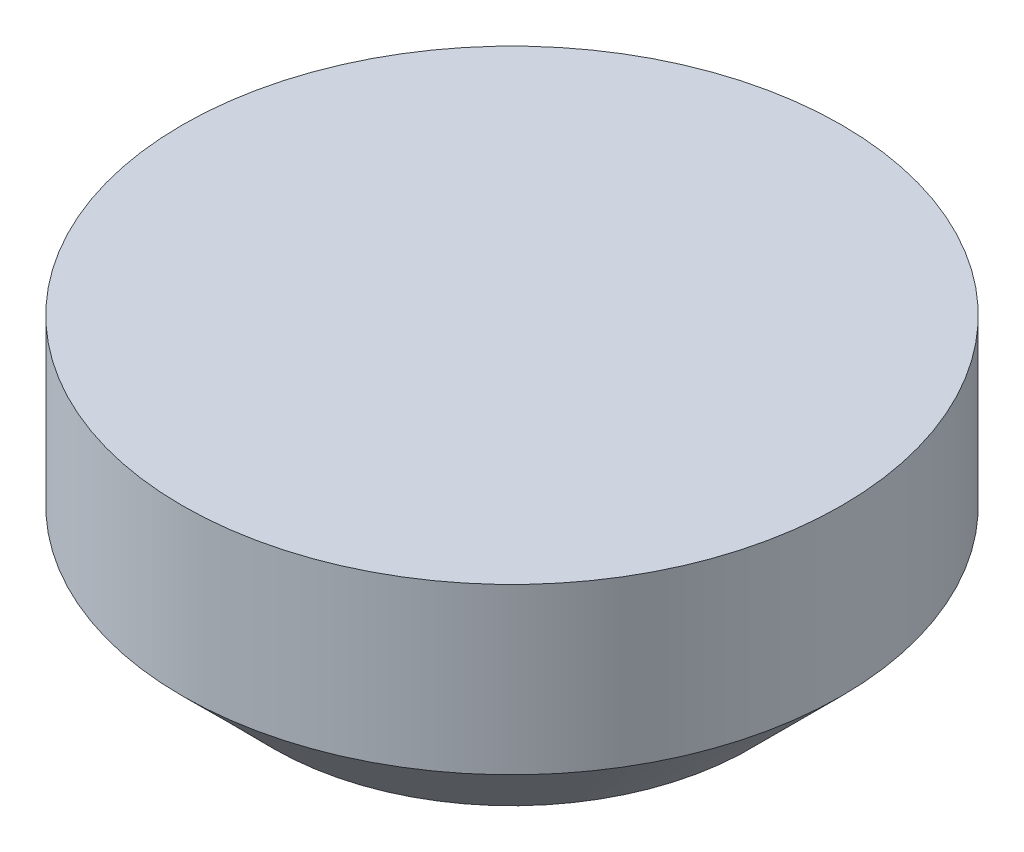
ISO-10303-21;
HEADER;
FILE_DESCRIPTION(('STEP AP214'),'2;1');
FILE_NAME('part.step','',(''),(''),'','','');
FILE_SCHEMA(('AUTOMOTIVE_DESIGN { 1 0 10303 214 1 1 1 1 }'));
ENDSEC;
DATA;
#1=APPLICATION_CONTEXT('core data for automotive mechanical design processes');
#2=APPLICATION_PROTOCOL_DEFINITION('international standard','automotive_design',2000,#1);
#3=PRODUCT_CONTEXT('',#1,'mechanical');
#4=PRODUCT('Part','Part','',(#3));
#5=PRODUCT_RELATED_PRODUCT_CATEGORY('part','',(#4));
#6=PRODUCT_DEFINITION_FORMATION('','',#4);
#7=PRODUCT_DEFINITION_CONTEXT('part definition',#1,'design');
#8=PRODUCT_DEFINITION('design','',#6,#7);
#9=PRODUCT_DEFINITION_SHAPE('','',#8);
#10=(LENGTH_UNIT() NAMED_UNIT(*) SI_UNIT(.MILLI.,.METRE.));
#11=(NAMED_UNIT(*) PLANE_ANGLE_UNIT() SI_UNIT($,.RADIAN.));
#12=(NAMED_UNIT(*) SI_UNIT($,.STERADIAN.) SOLID_ANGLE_UNIT());
#13=UNCERTAINTY_MEASURE_WITH_UNIT(LENGTH_MEASURE(1.E-05),#10,'distance_accuracy_value','');
#14=(GEOMETRIC_REPRESENTATION_CONTEXT(3) GLOBAL_UNCERTAINTY_ASSIGNED_CONTEXT((#13)) GLOBAL_UNIT_ASSIGNED_CONTEXT((#10,
#11,#12)) REPRESENTATION_CONTEXT('',''));
#15=CARTESIAN_POINT('',(0.,0.,0.));
#16=DIRECTION('',(0.,0.,1.));
#17=DIRECTION('',(1.,0.,0.));
#18=AXIS2_PLACEMENT_3D('',#15,#16,#17);
#19=CARTESIAN_POINT('',(0.,0.,0.));
#20=DIRECTION('',(0.,-1.,0.));
#21=DIRECTION('',(0.,0.,-1.));
#22=AXIS2_PLACEMENT_3D('',#19,#20,#21);
#23=PLANE('',#22);
#24=CARTESIAN_POINT('',(0.,0.,0.));
#25=DIRECTION('',(0.,-1.,0.));
#26=DIRECTION('',(0.,0.,-1.));
#27=AXIS2_PLACEMENT_3D('',#24,#25,#26);
#28=CIRCLE('',#27,9.);
#29=CARTESIAN_POINT('',(0.,0.,-9.));
#30=VERTEX_POINT('',#29);
#31=EDGE_CURVE('E10',#30,#30,#28,.T.);
#32=ORIENTED_EDGE('',*,*,#31,.F.);
#33=EDGE_LOOP('',(#32));
#34=FACE_BOUND('',#33,.T.);
#35=ADVANCED_FACE('F33',(#34),#23,.F.);
#36=CARTESIAN_POINT('',(0.,-2.,0.));
#37=DIRECTION('',(0.,-1.,0.));
#38=DIRECTION('',(0.,0.,-1.));
#39=AXIS2_PLACEMENT_3D('',#36,#37,#38);
#40=CYLINDRICAL_SURFACE('',#39,9.);
#41=CARTESIAN_POINT('',(0.,-4.5,0.));
#42=DIRECTION('',(0.,-1.,0.));
#43=DIRECTION('',(0.,0.,-1.));
#44=AXIS2_PLACEMENT_3D('',#41,#42,#43);
#45=CIRCLE('',#44,9.);
#46=CARTESIAN_POINT('',(0.,-4.5,-9.));
#47=VERTEX_POINT('',#46);
#48=EDGE_CURVE('E39',#47,#47,#45,.T.);
#49=ORIENTED_EDGE('',*,*,#48,.F.);
#50=EDGE_LOOP('',(#49));
#51=FACE_BOUND('',#50,.T.);
#52=ORIENTED_EDGE('',*,*,#31,.T.);
#53=EDGE_LOOP('',(#52));
#54=FACE_BOUND('',#53,.T.);
#55=ADVANCED_FACE('F72',(#51,#54),#40,.T.);
#56=CARTESIAN_POINT('',(0.,-4.5,0.));
#57=DIRECTION('',(0.,1.,0.));
#58=DIRECTION('',(0.,0.,1.));
#59=AXIS2_PLACEMENT_3D('',#56,#57,#58);
#60=CONICAL_SURFACE('',#59,9.,0.785398163397448);
#61=CARTESIAN_POINT('',(0.,-7.,0.));
#62=DIRECTION('',(0.,-1.,0.));
#63=DIRECTION('',(0.,0.,-1.));
#64=AXIS2_PLACEMENT_3D('',#61,#62,#63);
#65=CIRCLE('',#64,6.5);
#66=CARTESIAN_POINT('',(0.,-7.,-6.5));
#67=VERTEX_POINT('',#66);
#68=EDGE_CURVE('E43',#67,#67,#65,.T.);
#69=ORIENTED_EDGE('',*,*,#68,.F.);
#70=EDGE_LOOP('',(#69));
#71=FACE_BOUND('',#70,.T.);
#72=ORIENTED_EDGE('',*,*,#48,.T.);
#73=EDGE_LOOP('',(#72));
#74=FACE_BOUND('',#73,.T.);
#75=ADVANCED_FACE('F67',(#71,#74),#60,.T.);
#76=CARTESIAN_POINT('',(-6.5,-7.,0.));
#77=DIRECTION('',(0.,1.,0.));
#78=DIRECTION('',(0.,0.,1.));
#79=AXIS2_PLACEMENT_3D('',#76,#77,#78);
#80=PLANE('',#79);
#81=CARTESIAN_POINT('',(0.,-7.,0.));
#82=DIRECTION('',(0.,-1.,0.));
#83=DIRECTION('',(0.,0.,-1.));
#84=AXIS2_PLACEMENT_3D('',#81,#82,#83);
#85=CIRCLE('',#84,6.);
#86=CARTESIAN_POINT('',(0.,-7.,-6.));
#87=VERTEX_POINT('',#86);
#88=EDGE_CURVE('E47',#87,#87,#85,.T.);
#89=ORIENTED_EDGE('',*,*,#88,.F.);
#90=EDGE_LOOP('',(#89));
#91=FACE_BOUND('',#90,.T.);
#92=ORIENTED_EDGE('',*,*,#68,.T.);
#93=EDGE_LOOP('',(#92));
#94=FACE_BOUND('',#93,.T.);
#95=ADVANCED_FACE('F61',(#91,#94),#80,.F.);
#96=CARTESIAN_POINT('',(0.,-2.,0.));
#97=DIRECTION('',(0.,-1.,0.));
#98=DIRECTION('',(0.,0.,-1.));
#99=AXIS2_PLACEMENT_3D('',#96,#97,#98);
#100=CYLINDRICAL_SURFACE('',#99,6.);
#101=CARTESIAN_POINT('',(0.,-2.,0.));
#102=DIRECTION('',(0.,-1.,0.));
#103=DIRECTION('',(0.,0.,-1.));
#104=AXIS2_PLACEMENT_3D('',#101,#102,#103);
#105=CIRCLE('',#104,6.);
#106=CARTESIAN_POINT('',(0.,-2.,-6.));
#107=VERTEX_POINT('',#106);
#108=EDGE_CURVE('E52',#107,#107,#105,.T.);
#109=ORIENTED_EDGE('',*,*,#108,.F.);
#110=EDGE_LOOP('',(#109));
#111=FACE_BOUND('',#110,.T.);
#112=ORIENTED_EDGE('',*,*,#88,.T.);
#113=EDGE_LOOP('',(#112));
#114=FACE_BOUND('',#113,.T.);
#115=ADVANCED_FACE('F58',(#111,#114),#100,.F.);
#116=CARTESIAN_POINT('',(-6.,-2.,0.));
#117=DIRECTION('',(0.,1.,0.));
#118=DIRECTION('',(0.,0.,1.));
#119=AXIS2_PLACEMENT_3D('',#116,#117,#118);
#120=PLANE('',#119);
#121=ORIENTED_EDGE('',*,*,#108,.T.);
#122=EDGE_LOOP('',(#121));
#123=FACE_BOUND('',#122,.T.);
#124=ADVANCED_FACE('F56',(#123),#120,.F.);
#125=CLOSED_SHELL('',(#35,#55,#75,#95,#115,#124));
#126=MANIFOLD_SOLID_BREP('B2',#125);
#127=ADVANCED_BREP_SHAPE_REPRESENTATION('',(#18,#126),#14);
#128=SHAPE_DEFINITION_REPRESENTATION(#9,#127);
ENDSEC;
END-ISO-10303-21;
